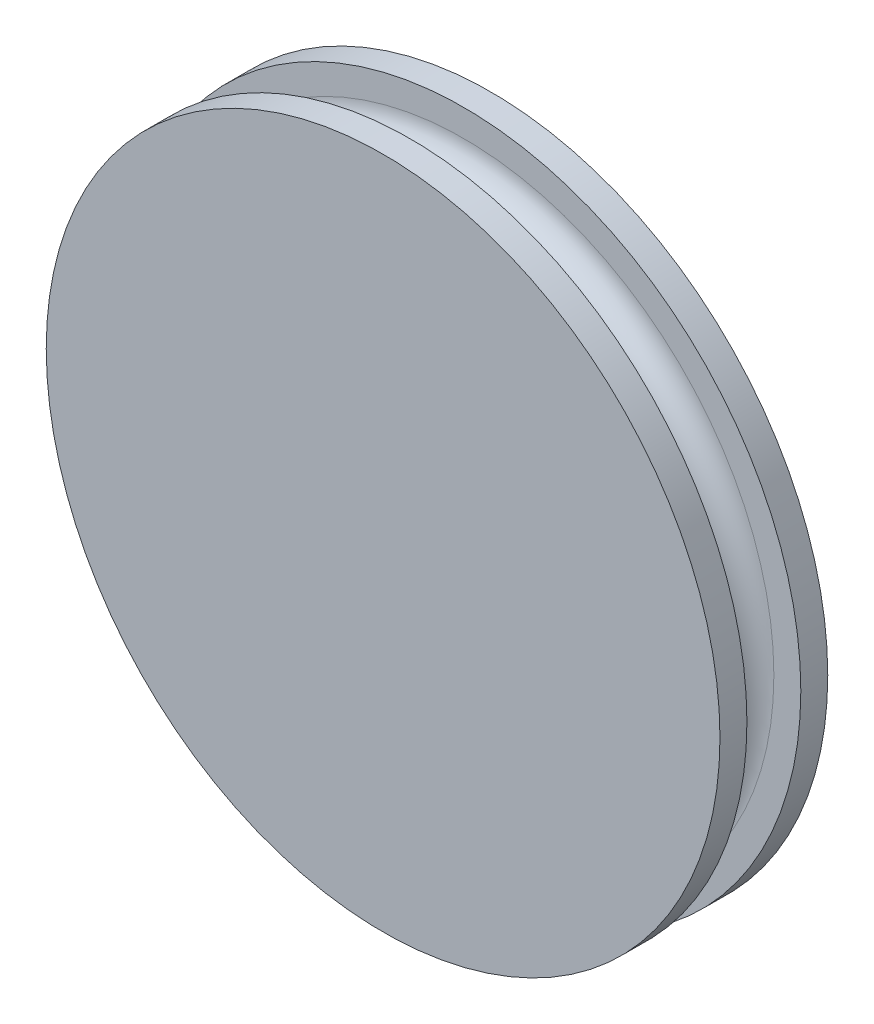
ISO-10303-21;
HEADER;
FILE_DESCRIPTION(('STEP AP214'),'2;1');
FILE_NAME('part.step','',(''),(''),'','','');
FILE_SCHEMA(('AUTOMOTIVE_DESIGN { 1 0 10303 214 1 1 1 1 }'));
ENDSEC;
DATA;
#1=APPLICATION_CONTEXT('core data for automotive mechanical design processes');
#2=APPLICATION_PROTOCOL_DEFINITION('international standard','automotive_design',2000,#1);
#3=PRODUCT_CONTEXT('',#1,'mechanical');
#4=PRODUCT('Part','Part','',(#3));
#5=PRODUCT_RELATED_PRODUCT_CATEGORY('part','',(#4));
#6=PRODUCT_DEFINITION_FORMATION('','',#4);
#7=PRODUCT_DEFINITION_CONTEXT('part definition',#1,'design');
#8=PRODUCT_DEFINITION('design','',#6,#7);
#9=PRODUCT_DEFINITION_SHAPE('','',#8);
#10=(LENGTH_UNIT() NAMED_UNIT(*) SI_UNIT(.MILLI.,.METRE.));
#11=(NAMED_UNIT(*) PLANE_ANGLE_UNIT() SI_UNIT($,.RADIAN.));
#12=(NAMED_UNIT(*) SI_UNIT($,.STERADIAN.) SOLID_ANGLE_UNIT());
#13=UNCERTAINTY_MEASURE_WITH_UNIT(LENGTH_MEASURE(1.E-05),#10,'distance_accuracy_value','');
#14=(GEOMETRIC_REPRESENTATION_CONTEXT(3) GLOBAL_UNCERTAINTY_ASSIGNED_CONTEXT((#13)) GLOBAL_UNIT_ASSIGNED_CONTEXT((#10,
#11,#12)) REPRESENTATION_CONTEXT('',''));
#15=CARTESIAN_POINT('',(0.,0.,0.));
#16=DIRECTION('',(0.,0.,1.));
#17=DIRECTION('',(1.,0.,0.));
#18=AXIS2_PLACEMENT_3D('',#15,#16,#17);
#19=CARTESIAN_POINT('',(0.,0.,7.5));
#20=DIRECTION('',(0.,0.,-1.));
#21=DIRECTION('',(-1.,0.,0.));
#22=AXIS2_PLACEMENT_3D('',#19,#20,#21);
#23=CYLINDRICAL_SURFACE('',#22,5.75);
#24=CARTESIAN_POINT('',(0.,0.,7.5));
#25=DIRECTION('',(0.,0.,1.));
#26=DIRECTION('',(1.,0.,0.));
#27=AXIS2_PLACEMENT_3D('',#24,#25,#26);
#28=CIRCLE('',#27,5.75);
#29=CARTESIAN_POINT('',(5.75,0.,7.5));
#30=VERTEX_POINT('',#29);
#31=EDGE_CURVE('E112',#30,#30,#28,.T.);
#32=ORIENTED_EDGE('',*,*,#31,.F.);
#33=EDGE_LOOP('',(#32));
#34=FACE_BOUND('',#33,.T.);
#35=CARTESIAN_POINT('',(0.,0.,0.));
#36=DIRECTION('',(0.,0.,1.));
#37=DIRECTION('',(1.,0.,0.));
#38=AXIS2_PLACEMENT_3D('',#35,#36,#37);
#39=CIRCLE('',#38,5.75);
#40=CARTESIAN_POINT('',(5.75,0.,0.));
#41=VERTEX_POINT('',#40);
#42=EDGE_CURVE('E90',#41,#41,#39,.T.);
#43=ORIENTED_EDGE('',*,*,#42,.T.);
#44=EDGE_LOOP('',(#43));
#45=FACE_BOUND('',#44,.T.);
#46=CARTESIAN_POINT('',(0.,-5.75,2.25));
#47=CARTESIAN_POINT('',(0.0827565504301497,-5.74999869210413,2.25000209693434));
#48=CARTESIAN_POINT('',(0.165535896333785,-5.74819573678926,2.25687163655909));
#49=CARTESIAN_POINT('',(0.328714260063833,-5.74117834518274,2.28412231590813));
#50=CARTESIAN_POINT('',(0.409112038400622,-5.73596216398353,2.30451036662962));
#51=CARTESIAN_POINT('',(0.565147916645536,-5.72269471803663,2.35809337090641));
#52=CARTESIAN_POINT('',(0.640791866299035,-5.71464702139503,2.39127221128726));
#53=CARTESIAN_POINT('',(0.785441100183015,-5.6965693697918,2.46943630696442));
#54=CARTESIAN_POINT('',(0.854446018094282,-5.68653930554301,2.51442221322454));
#55=CARTESIAN_POINT('',(0.985395243676025,-5.66533217333061,2.6159814469638));
#56=CARTESIAN_POINT('',(1.04717061891579,-5.65413616833994,2.67276864635182));
#57=CARTESIAN_POINT('',(1.16043774099598,-5.63198208961254,2.79586104532487));
#58=CARTESIAN_POINT('',(1.21192822336676,-5.62102404527915,2.86216741351781));
#59=CARTESIAN_POINT('',(1.30397724199551,-5.60039389168282,3.00375134761141));
#60=CARTESIAN_POINT('',(1.34434334141883,-5.59074572831206,3.07915783233057));
#61=CARTESIAN_POINT('',(1.41175895890956,-5.57410537320255,3.23597925944645));
#62=CARTESIAN_POINT('',(1.43881081557756,-5.56711271508282,3.31739314377334));
#63=CARTESIAN_POINT('',(1.47824702752586,-5.55677031015972,3.48205207693459));
#64=CARTESIAN_POINT('',(1.4909367764617,-5.55334484273862,3.56521911320192));
#65=CARTESIAN_POINT('',(1.50224036987484,-5.55029828055544,3.73256671426478));
#66=CARTESIAN_POINT('',(1.50085672263456,-5.55067650786586,3.81674709578191));
#67=CARTESIAN_POINT('',(1.48429567965221,-5.55512672552155,3.98136354888448));
#68=CARTESIAN_POINT('',(1.46948580722496,-5.55910029308473,4.06183967593879));
#69=CARTESIAN_POINT('',(1.42708051177427,-5.57013613953299,4.21912354975146));
#70=CARTESIAN_POINT('',(1.39948410614448,-5.57719865579208,4.29593101408373));
#71=CARTESIAN_POINT('',(1.33198478786635,-5.59370451635369,4.44466500616162));
#72=CARTESIAN_POINT('',(1.29195142735603,-5.60317289375448,4.51652943813691));
#73=CARTESIAN_POINT('',(1.20080568188756,-5.62340993425445,4.65265059868277));
#74=CARTESIAN_POINT('',(1.14969120122697,-5.63417884314409,4.71690588462427));
#75=CARTESIAN_POINT('',(1.03594627958334,-5.65621492770398,4.83808686840544));
#76=CARTESIAN_POINT('',(0.973006666448501,-5.66748717408484,4.8947218365863));
#77=CARTESIAN_POINT('',(0.838386315191362,-5.68895837312073,4.996691023225));
#78=CARTESIAN_POINT('',(0.766705261397835,-5.69915728699075,5.04202483339494));
#79=CARTESIAN_POINT('',(0.616199144394333,-5.71739102831751,5.12022524939923));
#80=CARTESIAN_POINT('',(0.537346599066203,-5.72541701813719,5.15304115761805));
#81=CARTESIAN_POINT('',(0.374987203608012,-5.73833660089413,5.20486839903262));
#82=CARTESIAN_POINT('',(0.291481329325966,-5.74323084792075,5.22388261493297));
#83=CARTESIAN_POINT('',(0.124668448145181,-5.74923732985035,5.24711467751892));
#84=CARTESIAN_POINT('',(0.0414200784096542,-5.75045062870886,5.2517280193963));
#85=CARTESIAN_POINT('',(-0.124660236000428,-5.74924810980225,5.24711693765466));
#86=CARTESIAN_POINT('',(-0.207492220924062,-5.74683264984631,5.23789387835659));
#87=CARTESIAN_POINT('',(-0.36899009898606,-5.73870911781798,5.20619679539611));
#88=CARTESIAN_POINT('',(-0.447701939255477,-5.73305546646209,5.18394165257679));
#89=CARTESIAN_POINT('',(-0.600268715228634,-5.71909531448199,5.12706484114888));
#90=CARTESIAN_POINT('',(-0.674123135616293,-5.71078853293703,5.09244186295373));
#91=CARTESIAN_POINT('',(-0.816428443616214,-5.69220484598953,5.01106699540685));
#92=CARTESIAN_POINT('',(-0.884750411419281,-5.68189358941189,4.9640976943347));
#93=CARTESIAN_POINT('',(-1.01268222253221,-5.66049369913368,4.8596383923464));
#94=CARTESIAN_POINT('',(-1.07229041806259,-5.64940491898805,4.80214640620134));
#95=CARTESIAN_POINT('',(-1.18275627994778,-5.6273307326366,4.67643117214288));
#96=CARTESIAN_POINT('',(-1.23333544423788,-5.61635612995624,4.60796086800374));
#97=CARTESIAN_POINT('',(-1.3222896776832,-5.5960825093024,4.46327439010581));
#98=CARTESIAN_POINT('',(-1.36066527119569,-5.58678341934373,4.38705854933931));
#99=CARTESIAN_POINT('',(-1.42383428632845,-5.57101932883982,4.22943708078667));
#100=CARTESIAN_POINT('',(-1.44870733752348,-5.5645377585197,4.14806511141697));
#101=CARTESIAN_POINT('',(-1.48436197994453,-5.55513419747947,3.98209707469164));
#102=CARTESIAN_POINT('',(-1.49514698498135,-5.5522113444238,3.89750179352325));
#103=CARTESIAN_POINT('',(-1.50212929714525,-5.55032597891716,3.73033352927471));
#104=CARTESIAN_POINT('',(-1.49877331702716,-5.55124218564566,3.64778028650471));
#105=CARTESIAN_POINT('',(-1.47860023277945,-5.55664900804772,3.4844606280366));
#106=CARTESIAN_POINT('',(-1.46178344725374,-5.56113953912056,3.40369417009355));
#107=CARTESIAN_POINT('',(-1.41541989316566,-5.57311845404139,3.24677581677364));
#108=CARTESIAN_POINT('',(-1.38596393084726,-5.58058542694998,3.17059534300181));
#109=CARTESIAN_POINT('',(-1.31522905504201,-5.59767724921602,3.02420105076281));
#110=CARTESIAN_POINT('',(-1.273948361164,-5.6073024234757,2.95398813286678));
#111=CARTESIAN_POINT('',(-1.17936548934914,-5.62796582443248,2.81938035166689));
#112=CARTESIAN_POINT('',(-1.12575664428232,-5.63903628879905,2.75520588752847));
#113=CARTESIAN_POINT('',(-1.00862756716089,-5.66115857831811,2.63661858880263));
#114=CARTESIAN_POINT('',(-0.94510495002805,-5.67221039833667,2.58220811004711));
#115=CARTESIAN_POINT('',(-0.808402581432237,-5.69331699830976,2.4836156116059));
#116=CARTESIAN_POINT('',(-0.735053640266802,-5.70334712127171,2.43966247041353));
#117=CARTESIAN_POINT('',(-0.581750060014079,-5.72101404443558,2.36478043939368));
#118=CARTESIAN_POINT('',(-0.501799879836509,-5.72865244372007,2.33384284272776));
#119=CARTESIAN_POINT('',(-0.351741777794351,-5.73963699654114,2.29010420641963));
#120=CARTESIAN_POINT('',(-0.282305646729965,-5.74349538660568,2.27509918594351));
#121=CARTESIAN_POINT('',(-0.141918507101204,-5.74867733519136,2.25504663119056));
#122=CARTESIAN_POINT('',(-0.0709676352972892,-5.75000112158224,2.24999820178015));
#123=CARTESIAN_POINT('',(0.,-5.75,2.25));
#124=B_SPLINE_CURVE_WITH_KNOTS('',3,(#46,#47,#48,#49,#50,#51,#52,#53,#54,#55,#56,#57,#58,#59,
#60,#61,#62,#63,#64,#65,#66,#67,#68,#69,#70,#71,#72,#73,#74,#75,#76,#77,#78,#79,#80,#81,#82,#83,
#84,#85,#86,#87,#88,#89,#90,#91,#92,#93,#94,#95,#96,#97,#98,#99,#100,#101,#102,#103,#104,#105,
#106,#107,#108,#109,#110,#111,#112,#113,#114,#115,#116,#117,#118,#119,#120,#121,#122,#123),
.UNSPECIFIED.,.T.,.F.,(4,2,2,2,2,2,2,2,2,2,2,2,2,2,2,2,2,2,2,2,2,2,2,2,2,2,2,2,2,2,2,2,2,2,2,2,
2,2,4),(0.,0.248009461318893,0.496145809063828,0.743970583594285,0.991809024421143,
1.24460721819603,1.49743647298028,1.75439818241906,2.01131474130253,2.26265911775352,
2.51395869822046,2.75858040416548,3.00322091166615,3.25051934152511,3.49786458224272,
3.7529160379782,4.00797670687022,4.26405967513086,4.520089140957,4.76902239537675,
5.01793110565878,5.2627745289135,5.50764388546504,5.75715356277692,6.00671036165089,
6.26297981565022,6.51923825689677,6.7739685583984,7.02863712227793,7.27532204322615,
7.52200112555968,7.76693685868474,8.01190948996992,8.26380271891956,8.51575664261029,
8.7728012919595,9.02967371503768,9.24237261906137,9.45505239981192),.UNSPECIFIED.);
#125=CARTESIAN_POINT('',(0.,-5.75,2.25));
#126=VERTEX_POINT('',#125);
#127=EDGE_CURVE('E102',#126,#126,#124,.T.);
#128=ORIENTED_EDGE('',*,*,#127,.F.);
#129=EDGE_LOOP('',(#128));
#130=FACE_BOUND('',#129,.T.);
#131=ADVANCED_FACE('F33',(#34,#45,#130),#23,.T.);
#132=CARTESIAN_POINT('',(0.,0.,7.5));
#133=DIRECTION('',(0.,0.,-1.));
#134=DIRECTION('',(-1.,0.,0.));
#135=AXIS2_PLACEMENT_3D('',#132,#133,#134);
#136=CYLINDRICAL_SURFACE('',#135,3.25);
#137=DIRECTION('',(0.,0.,-1.));
#138=VECTOR('',#137,1.);
#139=CARTESIAN_POINT('',(1.25,-3.,7.5));
#140=LINE('',#139,#138);
#141=CARTESIAN_POINT('',(1.25,-3.,2.92084380241115));
#142=VERTEX_POINT('',#141);
#143=CARTESIAN_POINT('',(1.25,-3.,0.));
#144=VERTEX_POINT('',#143);
#145=EDGE_CURVE('E57',#142,#144,#140,.T.);
#146=ORIENTED_EDGE('',*,*,#145,.F.);
#147=CARTESIAN_POINT('',(1.25,-3.,2.92084380241115));
#148=CARTESIAN_POINT('',(1.27172514561493,-2.99094750043449,2.95360031687166));
#149=CARTESIAN_POINT('',(1.29218997927017,-2.98214400465117,2.98724450316073));
#150=CARTESIAN_POINT('',(1.33048584152071,-2.96525639730216,3.05619394889487));
#151=CARTESIAN_POINT('',(1.3483155630174,-2.95717264353627,3.09150002131595));
#152=CARTESIAN_POINT('',(1.39772642757931,-2.93431202784699,3.19985342516203));
#153=CARTESIAN_POINT('',(1.42512930169679,-2.92096905210256,3.27518577243254));
#154=CARTESIAN_POINT('',(1.46773728638656,-2.89979747650683,3.43025586684016));
#155=CARTESIAN_POINT('',(1.48290020132484,-2.89198796374557,3.51000784918186));
#156=CARTESIAN_POINT('',(1.50010611656845,-2.88310279540692,3.67112949968485));
#157=CARTESIAN_POINT('',(1.50218041997785,-2.88201107352081,3.75249484095111));
#158=CARTESIAN_POINT('',(1.49346669152586,-2.88653289509588,3.90913277764906));
#159=CARTESIAN_POINT('',(1.48348462307872,-2.89172632323209,3.98446499215868));
#160=CARTESIAN_POINT('',(1.45242234320089,-2.90745036573511,4.13234153768666));
#161=CARTESIAN_POINT('',(1.43132483967447,-2.91798929505314,4.20488133538098));
#162=CARTESIAN_POINT('',(1.38496265701551,-2.94021634641545,4.32895836744027));
#163=CARTESIAN_POINT('',(1.36180892709043,-2.95106688108446,4.38145598423028));
#164=CARTESIAN_POINT('',(1.3099566255557,-2.97444313091225,4.48297388657214));
#165=CARTESIAN_POINT('',(1.28128038442857,-2.98696203918283,4.5320071243584));
#166=CARTESIAN_POINT('',(1.25,-3.,4.57915619758885));
#167=B_SPLINE_CURVE_WITH_KNOTS('',3,(#147,#148,#149,#150,#151,#152,#153,#154,#155,#156,#157,
#158,#159,#160,#161,#162,#163,#164,#165,#166),.UNSPECIFIED.,.F.,.F.,(4,2,2,2,2,2,2,2,2,4),(0.,
0.120944039773371,0.241947871689213,0.484505655582223,0.727896096392393,0.970704216214176,
1.19814086506599,1.42593238260041,1.60073582991671,1.77484675585572),.UNSPECIFIED.);
#168=CARTESIAN_POINT('',(1.25,-3.,4.57915619758885));
#169=VERTEX_POINT('',#168);
#170=EDGE_CURVE('E124',#142,#169,#167,.T.);
#171=ORIENTED_EDGE('',*,*,#170,.T.);
#172=CARTESIAN_POINT('',(1.25,-3.,7.5));
#173=VERTEX_POINT('',#172);
#174=EDGE_CURVE('E95',#173,#169,#140,.T.);
#175=ORIENTED_EDGE('',*,*,#174,.F.);
#176=CARTESIAN_POINT('',(0.,0.,7.5));
#177=DIRECTION('',(0.,0.,1.));
#178=DIRECTION('',(1.,0.,0.));
#179=AXIS2_PLACEMENT_3D('',#176,#177,#178);
#180=CIRCLE('',#179,3.25);
#181=CARTESIAN_POINT('',(-1.25,-3.,7.5));
#182=VERTEX_POINT('',#181);
#183=EDGE_CURVE('E80',#173,#182,#180,.T.);
#184=ORIENTED_EDGE('',*,*,#183,.T.);
#185=DIRECTION('',(0.,0.,-1.));
#186=VECTOR('',#185,1.);
#187=CARTESIAN_POINT('',(-1.25,-3.,7.5));
#188=LINE('',#187,#186);
#189=CARTESIAN_POINT('',(-1.25,-3.,4.57915619758885));
#190=VERTEX_POINT('',#189);
#191=EDGE_CURVE('E86',#182,#190,#188,.T.);
#192=ORIENTED_EDGE('',*,*,#191,.T.);
#193=CARTESIAN_POINT('',(-1.25,-3.,4.57915619758885));
#194=CARTESIAN_POINT('',(-1.27172514561493,-2.99094750043449,4.54639968312834));
#195=CARTESIAN_POINT('',(-1.29218997927017,-2.98214400465117,4.51275549683927));
#196=CARTESIAN_POINT('',(-1.33048584152071,-2.96525639730216,4.44380605110513));
#197=CARTESIAN_POINT('',(-1.3483155630174,-2.95717264353627,4.40849997868405));
#198=CARTESIAN_POINT('',(-1.39772642757931,-2.93431202784699,4.30014657483797));
#199=CARTESIAN_POINT('',(-1.42512930169679,-2.92096905210256,4.22481422756746));
#200=CARTESIAN_POINT('',(-1.46773728638656,-2.89979747650683,4.06974413315984));
#201=CARTESIAN_POINT('',(-1.48290020132484,-2.89198796374557,3.98999215081814));
#202=CARTESIAN_POINT('',(-1.50010611656845,-2.88310279540692,3.82887050031515));
#203=CARTESIAN_POINT('',(-1.50218041997785,-2.88201107352081,3.74750515904889));
#204=CARTESIAN_POINT('',(-1.49346669152586,-2.88653289509588,3.59086722235094));
#205=CARTESIAN_POINT('',(-1.48348462307872,-2.89172632323209,3.51553500784132));
#206=CARTESIAN_POINT('',(-1.45242234320089,-2.90745036573511,3.36765846231334));
#207=CARTESIAN_POINT('',(-1.43132483967447,-2.91798929505314,3.29511866461902));
#208=CARTESIAN_POINT('',(-1.3849626570155,-2.94021634641545,3.17104163255973));
#209=CARTESIAN_POINT('',(-1.36180892709043,-2.95106688108446,3.11854401576972));
#210=CARTESIAN_POINT('',(-1.3099566255557,-2.97444313091225,3.01702611342786));
#211=CARTESIAN_POINT('',(-1.28128038442857,-2.98696203918283,2.9679928756416));
#212=CARTESIAN_POINT('',(-1.25,-3.,2.92084380241115));
#213=B_SPLINE_CURVE_WITH_KNOTS('',3,(#193,#194,#195,#196,#197,#198,#199,#200,#201,#202,#203,
#204,#205,#206,#207,#208,#209,#210,#211,#212),.UNSPECIFIED.,.F.,.F.,(4,2,2,2,2,2,2,2,2,4),(0.,
0.120944039773371,0.241947871689213,0.484505655582224,0.727896096392395,0.970704216214177,
1.19814086506599,1.42593238260041,1.60073582991671,1.77484675585572),.UNSPECIFIED.);
#214=CARTESIAN_POINT('',(-1.25,-3.,2.92084380241115));
#215=VERTEX_POINT('',#214);
#216=EDGE_CURVE('E49',#190,#215,#213,.T.);
#217=ORIENTED_EDGE('',*,*,#216,.T.);
#218=CARTESIAN_POINT('',(-1.25,-3.,0.));
#219=VERTEX_POINT('',#218);
#220=EDGE_CURVE('E91',#215,#219,#188,.T.);
#221=ORIENTED_EDGE('',*,*,#220,.T.);
#222=CARTESIAN_POINT('',(0.,0.,0.));
#223=DIRECTION('',(0.,0.,1.));
#224=DIRECTION('',(1.,0.,0.));
#225=AXIS2_PLACEMENT_3D('',#222,#223,#224);
#226=CIRCLE('',#225,3.25);
#227=EDGE_CURVE('E99',#144,#219,#226,.T.);
#228=ORIENTED_EDGE('',*,*,#227,.F.);
#229=EDGE_LOOP('',(#146,#171,#175,#184,#192,#217,#221,#228));
#230=FACE_BOUND('',#229,.T.);
#231=ADVANCED_FACE('F93',(#230),#136,.F.);
#232=CARTESIAN_POINT('',(-1.25,-3.,7.5));
#233=DIRECTION('',(0.,1.,0.));
#234=DIRECTION('',(0.,0.,1.));
#235=AXIS2_PLACEMENT_3D('',#232,#233,#234);
#236=PLANE('',#235);
#237=ORIENTED_EDGE('',*,*,#220,.F.);
#238=CARTESIAN_POINT('',(0.,-3.,3.75));
#239=DIRECTION('',(0.,1.,0.));
#240=DIRECTION('',(0.,0.,1.));
#241=AXIS2_PLACEMENT_3D('',#238,#239,#240);
#242=CIRCLE('',#241,1.5);
#243=EDGE_CURVE('E118',#215,#142,#242,.F.);
#244=ORIENTED_EDGE('',*,*,#243,.T.);
#245=ORIENTED_EDGE('',*,*,#145,.T.);
#246=DIRECTION('',(1.,0.,0.));
#247=VECTOR('',#246,1.);
#248=CARTESIAN_POINT('',(-1.25,-3.,0.));
#249=LINE('',#248,#247);
#250=EDGE_CURVE('E96',#219,#144,#249,.T.);
#251=ORIENTED_EDGE('',*,*,#250,.F.);
#252=EDGE_LOOP('',(#237,#244,#245,#251));
#253=FACE_BOUND('',#252,.T.);
#254=ADVANCED_FACE('F123',(#253),#236,.T.);
#255=CARTESIAN_POINT('',(0.,0.,0.));
#256=DIRECTION('',(0.,0.,1.));
#257=DIRECTION('',(1.,0.,0.));
#258=AXIS2_PLACEMENT_3D('',#255,#256,#257);
#259=PLANE('',#258);
#260=ORIENTED_EDGE('',*,*,#42,.F.);
#261=EDGE_LOOP('',(#260));
#262=FACE_BOUND('',#261,.T.);
#263=ORIENTED_EDGE('',*,*,#227,.T.);
#264=ORIENTED_EDGE('',*,*,#250,.T.);
#265=EDGE_LOOP('',(#263,#264));
#266=FACE_BOUND('',#265,.T.);
#267=ADVANCED_FACE('F126',(#262,#266),#259,.F.);
#268=ORIENTED_EDGE('',*,*,#174,.T.);
#269=EDGE_CURVE('E88',#169,#190,#242,.F.);
#270=ORIENTED_EDGE('',*,*,#269,.T.);
#271=ORIENTED_EDGE('',*,*,#191,.F.);
#272=DIRECTION('',(1.,0.,0.));
#273=VECTOR('',#272,1.);
#274=CARTESIAN_POINT('',(-1.25,-3.,7.5));
#275=LINE('',#274,#273);
#276=EDGE_CURVE('E76',#182,#173,#275,.T.);
#277=ORIENTED_EDGE('',*,*,#276,.T.);
#278=EDGE_LOOP('',(#268,#270,#271,#277));
#279=FACE_BOUND('',#278,.T.);
#280=ADVANCED_FACE('F87',(#279),#236,.T.);
#281=CARTESIAN_POINT('',(0.,-1.,3.75));
#282=DIRECTION('',(0.,-1.,0.));
#283=DIRECTION('',(0.,0.,-1.));
#284=AXIS2_PLACEMENT_3D('',#281,#282,#283);
#285=CYLINDRICAL_SURFACE('',#284,1.5);
#286=ORIENTED_EDGE('',*,*,#216,.F.);
#287=ORIENTED_EDGE('',*,*,#269,.F.);
#288=ORIENTED_EDGE('',*,*,#170,.F.);
#289=ORIENTED_EDGE('',*,*,#243,.F.);
#290=EDGE_LOOP('',(#286,#287,#288,#289));
#291=FACE_BOUND('',#290,.T.);
#292=ORIENTED_EDGE('',*,*,#127,.T.);
#293=EDGE_LOOP('',(#292));
#294=FACE_BOUND('',#293,.T.);
#295=ADVANCED_FACE('F134',(#291,#294),#285,.F.);
#296=CARTESIAN_POINT('',(0.,0.,7.5));
#297=DIRECTION('',(0.,0.,1.));
#298=DIRECTION('',(1.,0.,0.));
#299=AXIS2_PLACEMENT_3D('',#296,#297,#298);
#300=PLANE('',#299);
#301=ORIENTED_EDGE('',*,*,#183,.F.);
#302=ORIENTED_EDGE('',*,*,#276,.F.);
#303=EDGE_LOOP('',(#301,#302));
#304=FACE_BOUND('',#303,.T.);
#305=ADVANCED_FACE('F78',(#304),#300,.F.);
#306=CARTESIAN_POINT('',(0.,0.,7.5));
#307=DIRECTION('',(0.,0.,1.));
#308=DIRECTION('',(1.,0.,0.));
#309=AXIS2_PLACEMENT_3D('',#306,#307,#308);
#310=CIRCLE('',#309,62.5);
#311=CARTESIAN_POINT('',(62.5,0.,7.5));
#312=VERTEX_POINT('',#311);
#313=EDGE_CURVE('E165',#312,#312,#310,.T.);
#314=ORIENTED_EDGE('',*,*,#313,.F.);
#315=EDGE_LOOP('',(#314));
#316=FACE_BOUND('',#315,.T.);
#317=ORIENTED_EDGE('',*,*,#31,.T.);
#318=EDGE_LOOP('',(#317));
#319=FACE_BOUND('',#318,.T.);
#320=ADVANCED_FACE('F189',(#316,#319),#300,.F.);
#321=CARTESIAN_POINT('',(0.,0.,12.5));
#322=DIRECTION('',(0.,0.,-1.));
#323=DIRECTION('',(-1.,0.,0.));
#324=AXIS2_PLACEMENT_3D('',#321,#322,#323);
#325=CYLINDRICAL_SURFACE('',#324,62.5);
#326=CARTESIAN_POINT('',(0.,0.,12.5));
#327=DIRECTION('',(0.,0.,1.));
#328=DIRECTION('',(1.,0.,0.));
#329=AXIS2_PLACEMENT_3D('',#326,#327,#328);
#330=CIRCLE('',#329,62.5);
#331=CARTESIAN_POINT('',(62.5,0.,12.5));
#332=VERTEX_POINT('',#331);
#333=EDGE_CURVE('E168',#332,#332,#330,.T.);
#334=ORIENTED_EDGE('',*,*,#333,.F.);
#335=EDGE_LOOP('',(#334));
#336=FACE_BOUND('',#335,.T.);
#337=ORIENTED_EDGE('',*,*,#313,.T.);
#338=EDGE_LOOP('',(#337));
#339=FACE_BOUND('',#338,.T.);
#340=ADVANCED_FACE('F183',(#336,#339),#325,.T.);
#341=CARTESIAN_POINT('',(0.,0.,12.5));
#342=DIRECTION('',(0.,0.,1.));
#343=DIRECTION('',(1.,0.,0.));
#344=AXIS2_PLACEMENT_3D('',#341,#342,#343);
#345=PLANE('',#344);
#346=CARTESIAN_POINT('',(0.,0.,12.5));
#347=DIRECTION('',(0.,0.,1.));
#348=DIRECTION('',(1.,0.,0.));
#349=AXIS2_PLACEMENT_3D('',#346,#347,#348);
#350=CIRCLE('',#349,57.5);
#351=CARTESIAN_POINT('',(57.5,0.,12.5));
#352=VERTEX_POINT('',#351);
#353=EDGE_CURVE('E42',#352,#352,#350,.F.);
#354=ORIENTED_EDGE('',*,*,#353,.T.);
#355=EDGE_LOOP('',(#354));
#356=FACE_BOUND('',#355,.T.);
#357=ORIENTED_EDGE('',*,*,#333,.T.);
#358=EDGE_LOOP('',(#357));
#359=FACE_BOUND('',#358,.T.);
#360=ADVANCED_FACE('F188',(#356,#359),#345,.T.);
#361=CARTESIAN_POINT('',(0.,0.,27.5));
#362=DIRECTION('',(0.,0.,-1.));
#363=DIRECTION('',(-1.,0.,0.));
#364=AXIS2_PLACEMENT_3D('',#361,#362,#363);
#365=CYLINDRICAL_SURFACE('',#364,62.5);
#366=CARTESIAN_POINT('',(0.,0.,27.5));
#367=DIRECTION('',(0.,0.,1.));
#368=DIRECTION('',(1.,0.,0.));
#369=AXIS2_PLACEMENT_3D('',#366,#367,#368);
#370=CIRCLE('',#369,62.5);
#371=CARTESIAN_POINT('',(62.5,0.,27.5));
#372=VERTEX_POINT('',#371);
#373=EDGE_CURVE('E160',#372,#372,#370,.T.);
#374=ORIENTED_EDGE('',*,*,#373,.F.);
#375=EDGE_LOOP('',(#374));
#376=FACE_BOUND('',#375,.T.);
#377=CARTESIAN_POINT('',(0.,0.,22.5));
#378=DIRECTION('',(0.,0.,1.));
#379=DIRECTION('',(1.,0.,0.));
#380=AXIS2_PLACEMENT_3D('',#377,#378,#379);
#381=CIRCLE('',#380,62.5);
#382=CARTESIAN_POINT('',(62.5,0.,22.5));
#383=VERTEX_POINT('',#382);
#384=EDGE_CURVE('E158',#383,#383,#381,.T.);
#385=ORIENTED_EDGE('',*,*,#384,.T.);
#386=EDGE_LOOP('',(#385));
#387=FACE_BOUND('',#386,.T.);
#388=ADVANCED_FACE('F195',(#376,#387),#365,.T.);
#389=CARTESIAN_POINT('',(0.,0.,27.5));
#390=DIRECTION('',(0.,0.,1.));
#391=DIRECTION('',(1.,0.,0.));
#392=AXIS2_PLACEMENT_3D('',#389,#390,#391);
#393=PLANE('',#392);
#394=ORIENTED_EDGE('',*,*,#373,.T.);
#395=EDGE_LOOP('',(#394));
#396=FACE_BOUND('',#395,.T.);
#397=ADVANCED_FACE('F198',(#396),#393,.T.);
#398=CARTESIAN_POINT('',(0.,0.,22.5));
#399=DIRECTION('',(0.,0.,1.));
#400=DIRECTION('',(1.,0.,0.));
#401=AXIS2_PLACEMENT_3D('',#398,#399,#400);
#402=PLANE('',#401);
#403=CARTESIAN_POINT('',(0.,0.,22.5));
#404=DIRECTION('',(0.,0.,1.));
#405=DIRECTION('',(1.,0.,0.));
#406=AXIS2_PLACEMENT_3D('',#403,#404,#405);
#407=CIRCLE('',#406,57.5);
#408=CARTESIAN_POINT('',(57.5,0.,22.5));
#409=VERTEX_POINT('',#408);
#410=EDGE_CURVE('E11',#409,#409,#407,.T.);
#411=ORIENTED_EDGE('',*,*,#410,.T.);
#412=EDGE_LOOP('',(#411));
#413=FACE_BOUND('',#412,.T.);
#414=ORIENTED_EDGE('',*,*,#384,.F.);
#415=EDGE_LOOP('',(#414));
#416=FACE_BOUND('',#415,.T.);
#417=ADVANCED_FACE('F152',(#413,#416),#402,.F.);
#418=CARTESIAN_POINT('',(0.,0.,17.5));
#419=DIRECTION('',(0.,0.,1.));
#420=DIRECTION('',(1.,0.,0.));
#421=AXIS2_PLACEMENT_3D('',#418,#419,#420);
#422=TOROIDAL_SURFACE('',#421,57.5,5.);
#423=ORIENTED_EDGE('',*,*,#410,.F.);
#424=EDGE_LOOP('',(#423));
#425=FACE_BOUND('',#424,.T.);
#426=CARTESIAN_POINT('',(0.,0.,17.5));
#427=DIRECTION('',(0.,0.,1.));
#428=DIRECTION('',(1.,0.,0.));
#429=AXIS2_PLACEMENT_3D('',#426,#427,#428);
#430=CIRCLE('',#429,52.5);
#431=CARTESIAN_POINT('',(52.5,0.,17.5));
#432=VERTEX_POINT('',#431);
#433=EDGE_CURVE('E37',#432,#432,#430,.F.);
#434=ORIENTED_EDGE('',*,*,#433,.F.);
#435=EDGE_LOOP('',(#434));
#436=FACE_BOUND('',#435,.T.);
#437=ADVANCED_FACE('F35',(#425,#436),#422,.F.);
#438=CARTESIAN_POINT('',(0.,0.,17.5));
#439=DIRECTION('',(0.,0.,1.));
#440=DIRECTION('',(1.,0.,0.));
#441=AXIS2_PLACEMENT_3D('',#438,#439,#440);
#442=TOROIDAL_SURFACE('',#441,57.5,5.);
#443=ORIENTED_EDGE('',*,*,#353,.F.);
#444=EDGE_LOOP('',(#443));
#445=FACE_BOUND('',#444,.T.);
#446=ORIENTED_EDGE('',*,*,#433,.T.);
#447=EDGE_LOOP('',(#446));
#448=FACE_BOUND('',#447,.T.);
#449=ADVANCED_FACE('F146',(#445,#448),#442,.F.);
#450=CLOSED_SHELL('',(#131,#231,#254,#267,#280,#295,#305,#320,#340,#360,#388,#397,#417,#437,#449));
#451=MANIFOLD_SOLID_BREP('B2',#450);
#452=ADVANCED_BREP_SHAPE_REPRESENTATION('',(#18,#451),#14);
#453=SHAPE_DEFINITION_REPRESENTATION(#9,#452);
ENDSEC;
END-ISO-10303-21;
